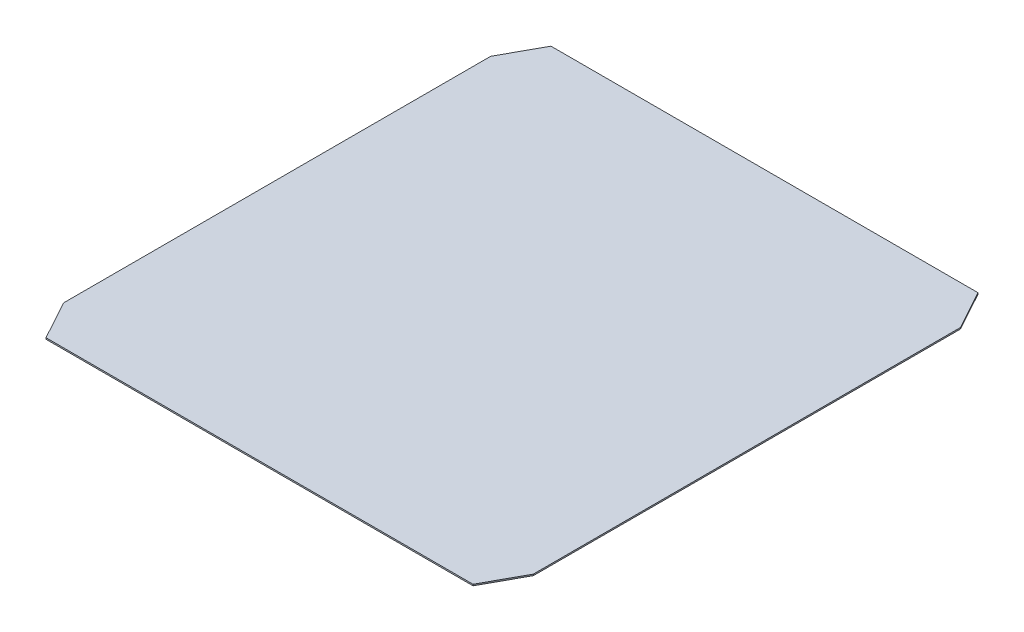
ISO-10303-21;
HEADER;
FILE_DESCRIPTION(('STEP AP214'),'2;1');
FILE_NAME('part.step','',(''),(''),'','','');
FILE_SCHEMA(('AUTOMOTIVE_DESIGN { 1 0 10303 214 1 1 1 1 }'));
ENDSEC;
DATA;
#1=APPLICATION_CONTEXT('core data for automotive mechanical design processes');
#2=APPLICATION_PROTOCOL_DEFINITION('international standard','automotive_design',2000,#1);
#3=PRODUCT_CONTEXT('',#1,'mechanical');
#4=PRODUCT('Part','Part','',(#3));
#5=PRODUCT_RELATED_PRODUCT_CATEGORY('part','',(#4));
#6=PRODUCT_DEFINITION_FORMATION('','',#4);
#7=PRODUCT_DEFINITION_CONTEXT('part definition',#1,'design');
#8=PRODUCT_DEFINITION('design','',#6,#7);
#9=PRODUCT_DEFINITION_SHAPE('','',#8);
#10=(LENGTH_UNIT() NAMED_UNIT(*) SI_UNIT(.MILLI.,.METRE.));
#11=(NAMED_UNIT(*) PLANE_ANGLE_UNIT() SI_UNIT($,.RADIAN.));
#12=(NAMED_UNIT(*) SI_UNIT($,.STERADIAN.) SOLID_ANGLE_UNIT());
#13=UNCERTAINTY_MEASURE_WITH_UNIT(LENGTH_MEASURE(1.E-05),#10,'distance_accuracy_value','');
#14=(GEOMETRIC_REPRESENTATION_CONTEXT(3) GLOBAL_UNCERTAINTY_ASSIGNED_CONTEXT((#13)) GLOBAL_UNIT_ASSIGNED_CONTEXT((#10,
#11,#12)) REPRESENTATION_CONTEXT('',''));
#15=CARTESIAN_POINT('',(0.,0.,0.));
#16=DIRECTION('',(0.,0.,1.));
#17=DIRECTION('',(1.,0.,0.));
#18=AXIS2_PLACEMENT_3D('',#15,#16,#17);
#19=CARTESIAN_POINT('',(-500.500000000008,-3.,-455.));
#20=DIRECTION('',(-1.,0.,0.));
#21=DIRECTION('',(0.,0.,1.));
#22=AXIS2_PLACEMENT_3D('',#19,#20,#21);
#23=PLANE('',#22);
#24=DIRECTION('',(0.,0.,1.));
#25=VECTOR('',#24,1.);
#26=CARTESIAN_POINT('',(-500.500000000008,0.,-455.));
#27=LINE('',#26,#25);
#28=CARTESIAN_POINT('',(-500.500000000008,0.,-455.));
#29=VERTEX_POINT('',#28);
#30=CARTESIAN_POINT('',(-500.500000000008,0.,455.));
#31=VERTEX_POINT('',#30);
#32=EDGE_CURVE('E133',#29,#31,#27,.T.);
#33=ORIENTED_EDGE('',*,*,#32,.F.);
#34=DIRECTION('',(0.,1.,0.));
#35=VECTOR('',#34,1.);
#36=CARTESIAN_POINT('',(-500.500000000008,-3.,-455.));
#37=LINE('',#36,#35);
#38=CARTESIAN_POINT('',(-500.500000000008,-3.,-455.));
#39=VERTEX_POINT('',#38);
#40=EDGE_CURVE('E11',#39,#29,#37,.T.);
#41=ORIENTED_EDGE('',*,*,#40,.F.);
#42=DIRECTION('',(0.,0.,1.));
#43=VECTOR('',#42,1.);
#44=CARTESIAN_POINT('',(-500.500000000008,-3.,-455.));
#45=LINE('',#44,#43);
#46=CARTESIAN_POINT('',(-500.500000000008,-3.,455.));
#47=VERTEX_POINT('',#46);
#48=EDGE_CURVE('E153',#39,#47,#45,.T.);
#49=ORIENTED_EDGE('',*,*,#48,.T.);
#50=DIRECTION('',(0.,1.,0.));
#51=VECTOR('',#50,1.);
#52=CARTESIAN_POINT('',(-500.500000000008,-3.,455.));
#53=LINE('',#52,#51);
#54=EDGE_CURVE('E39',#47,#31,#53,.T.);
#55=ORIENTED_EDGE('',*,*,#54,.T.);
#56=EDGE_LOOP('',(#33,#41,#49,#55));
#57=FACE_BOUND('',#56,.T.);
#58=ADVANCED_FACE('F36',(#57),#23,.T.);
#59=CARTESIAN_POINT('',(-500.500000000008,-3.,-455.));
#60=DIRECTION('',(-0.876884240003085,0.,-0.480701601447521));
#61=DIRECTION('',(-0.480701601447521,0.,0.876884240003085));
#62=AXIS2_PLACEMENT_3D('',#59,#60,#61);
#63=PLANE('',#62);
#64=DIRECTION('',(-0.480701601447521,0.,0.876884240003085));
#65=VECTOR('',#64,1.);
#66=CARTESIAN_POINT('',(-500.500000000008,0.,-455.));
#67=LINE('',#66,#65);
#68=CARTESIAN_POINT('',(-455.,0.,-538.000000000007));
#69=VERTEX_POINT('',#68);
#70=EDGE_CURVE('E151',#69,#29,#67,.T.);
#71=ORIENTED_EDGE('',*,*,#70,.F.);
#72=DIRECTION('',(0.,1.,0.));
#73=VECTOR('',#72,1.);
#74=CARTESIAN_POINT('',(-455.,-3.,-538.000000000007));
#75=LINE('',#74,#73);
#76=CARTESIAN_POINT('',(-455.,-3.,-538.000000000007));
#77=VERTEX_POINT('',#76);
#78=EDGE_CURVE('E45',#77,#69,#75,.T.);
#79=ORIENTED_EDGE('',*,*,#78,.F.);
#80=DIRECTION('',(-0.480701601447521,0.,0.876884240003085));
#81=VECTOR('',#80,1.);
#82=CARTESIAN_POINT('',(-500.500000000008,-3.,-455.));
#83=LINE('',#82,#81);
#84=EDGE_CURVE('E123',#77,#39,#83,.T.);
#85=ORIENTED_EDGE('',*,*,#84,.T.);
#86=ORIENTED_EDGE('',*,*,#40,.T.);
#87=EDGE_LOOP('',(#71,#79,#85,#86));
#88=FACE_BOUND('',#87,.T.);
#89=ADVANCED_FACE('F165',(#88),#63,.T.);
#90=CARTESIAN_POINT('',(454.999999999996,-3.,-538.00000000001));
#91=DIRECTION('',(0.,0.,-1.));
#92=DIRECTION('',(-1.,0.,0.));
#93=AXIS2_PLACEMENT_3D('',#90,#91,#92);
#94=PLANE('',#93);
#95=DIRECTION('',(-1.,0.,0.));
#96=VECTOR('',#95,1.);
#97=CARTESIAN_POINT('',(454.999999999996,0.,-538.00000000001));
#98=LINE('',#97,#96);
#99=CARTESIAN_POINT('',(454.999999999996,0.,-538.00000000001));
#100=VERTEX_POINT('',#99);
#101=EDGE_CURVE('E110',#100,#69,#98,.T.);
#102=ORIENTED_EDGE('',*,*,#101,.F.);
#103=DIRECTION('',(0.,1.,0.));
#104=VECTOR('',#103,1.);
#105=CARTESIAN_POINT('',(454.999999999996,-3.,-538.00000000001));
#106=LINE('',#105,#104);
#107=CARTESIAN_POINT('',(454.999999999996,-3.,-538.00000000001));
#108=VERTEX_POINT('',#107);
#109=EDGE_CURVE('E105',#108,#100,#106,.T.);
#110=ORIENTED_EDGE('',*,*,#109,.F.);
#111=DIRECTION('',(-1.,0.,0.));
#112=VECTOR('',#111,1.);
#113=CARTESIAN_POINT('',(454.999999999996,-3.,-538.00000000001));
#114=LINE('',#113,#112);
#115=EDGE_CURVE('E108',#108,#77,#114,.T.);
#116=ORIENTED_EDGE('',*,*,#115,.T.);
#117=ORIENTED_EDGE('',*,*,#78,.T.);
#118=EDGE_LOOP('',(#102,#110,#116,#117));
#119=FACE_BOUND('',#118,.T.);
#120=ADVANCED_FACE('F107',(#119),#94,.T.);
#121=CARTESIAN_POINT('',(500.500000000005,-3.,-455.000000000004));
#122=DIRECTION('',(0.876884240003082,0.,-0.480701601447528));
#123=DIRECTION('',(-0.480701601447528,0.,-0.876884240003082));
#124=AXIS2_PLACEMENT_3D('',#121,#122,#123);
#125=PLANE('',#124);
#126=DIRECTION('',(-0.480701601447528,0.,-0.876884240003082));
#127=VECTOR('',#126,1.);
#128=CARTESIAN_POINT('',(500.500000000005,0.,-455.000000000004));
#129=LINE('',#128,#127);
#130=CARTESIAN_POINT('',(500.500000000005,0.,-455.000000000004));
#131=VERTEX_POINT('',#130);
#132=EDGE_CURVE('E148',#131,#100,#129,.T.);
#133=ORIENTED_EDGE('',*,*,#132,.F.);
#134=DIRECTION('',(0.,1.,0.));
#135=VECTOR('',#134,1.);
#136=CARTESIAN_POINT('',(500.500000000005,-3.,-455.000000000004));
#137=LINE('',#136,#135);
#138=CARTESIAN_POINT('',(500.500000000005,-3.,-455.000000000004));
#139=VERTEX_POINT('',#138);
#140=EDGE_CURVE('E115',#139,#131,#137,.T.);
#141=ORIENTED_EDGE('',*,*,#140,.F.);
#142=DIRECTION('',(-0.480701601447528,0.,-0.876884240003082));
#143=VECTOR('',#142,1.);
#144=CARTESIAN_POINT('',(500.500000000005,-3.,-455.000000000004));
#145=LINE('',#144,#143);
#146=EDGE_CURVE('E121',#139,#108,#145,.T.);
#147=ORIENTED_EDGE('',*,*,#146,.T.);
#148=ORIENTED_EDGE('',*,*,#109,.T.);
#149=EDGE_LOOP('',(#133,#141,#147,#148));
#150=FACE_BOUND('',#149,.T.);
#151=ADVANCED_FACE('F125',(#150),#125,.T.);
#152=CARTESIAN_POINT('',(500.500000000005,-3.,455.000000000004));
#153=DIRECTION('',(1.,0.,0.));
#154=DIRECTION('',(0.,0.,-1.));
#155=AXIS2_PLACEMENT_3D('',#152,#153,#154);
#156=PLANE('',#155);
#157=DIRECTION('',(0.,0.,-1.));
#158=VECTOR('',#157,1.);
#159=CARTESIAN_POINT('',(500.500000000005,0.,455.000000000004));
#160=LINE('',#159,#158);
#161=CARTESIAN_POINT('',(500.500000000005,0.,455.000000000004));
#162=VERTEX_POINT('',#161);
#163=EDGE_CURVE('E145',#162,#131,#160,.T.);
#164=ORIENTED_EDGE('',*,*,#163,.F.);
#165=DIRECTION('',(0.,1.,0.));
#166=VECTOR('',#165,1.);
#167=CARTESIAN_POINT('',(500.500000000005,-3.,455.000000000004));
#168=LINE('',#167,#166);
#169=CARTESIAN_POINT('',(500.500000000005,-3.,455.000000000004));
#170=VERTEX_POINT('',#169);
#171=EDGE_CURVE('E157',#170,#162,#168,.T.);
#172=ORIENTED_EDGE('',*,*,#171,.F.);
#173=DIRECTION('',(0.,0.,-1.));
#174=VECTOR('',#173,1.);
#175=CARTESIAN_POINT('',(500.500000000005,-3.,455.000000000004));
#176=LINE('',#175,#174);
#177=EDGE_CURVE('E126',#170,#139,#176,.T.);
#178=ORIENTED_EDGE('',*,*,#177,.T.);
#179=ORIENTED_EDGE('',*,*,#140,.T.);
#180=EDGE_LOOP('',(#164,#172,#178,#179));
#181=FACE_BOUND('',#180,.T.);
#182=ADVANCED_FACE('F178',(#181),#156,.T.);
#183=CARTESIAN_POINT('',(500.500000000005,-3.,455.000000000004));
#184=DIRECTION('',(0.876884240003082,0.,0.480701601447528));
#185=DIRECTION('',(0.480701601447528,0.,-0.876884240003082));
#186=AXIS2_PLACEMENT_3D('',#183,#184,#185);
#187=PLANE('',#186);
#188=DIRECTION('',(0.480701601447528,0.,-0.876884240003082));
#189=VECTOR('',#188,1.);
#190=CARTESIAN_POINT('',(500.500000000005,0.,455.000000000004));
#191=LINE('',#190,#189);
#192=CARTESIAN_POINT('',(454.999999999996,0.,538.00000000001));
#193=VERTEX_POINT('',#192);
#194=EDGE_CURVE('E142',#193,#162,#191,.T.);
#195=ORIENTED_EDGE('',*,*,#194,.F.);
#196=DIRECTION('',(0.,1.,0.));
#197=VECTOR('',#196,1.);
#198=CARTESIAN_POINT('',(454.999999999996,-3.,538.00000000001));
#199=LINE('',#198,#197);
#200=CARTESIAN_POINT('',(454.999999999996,-3.,538.00000000001));
#201=VERTEX_POINT('',#200);
#202=EDGE_CURVE('E159',#201,#193,#199,.T.);
#203=ORIENTED_EDGE('',*,*,#202,.F.);
#204=DIRECTION('',(0.480701601447528,0.,-0.876884240003082));
#205=VECTOR('',#204,1.);
#206=CARTESIAN_POINT('',(500.500000000005,-3.,455.000000000004));
#207=LINE('',#206,#205);
#208=EDGE_CURVE('E128',#201,#170,#207,.T.);
#209=ORIENTED_EDGE('',*,*,#208,.T.);
#210=ORIENTED_EDGE('',*,*,#171,.T.);
#211=EDGE_LOOP('',(#195,#203,#209,#210));
#212=FACE_BOUND('',#211,.T.);
#213=ADVANCED_FACE('F181',(#212),#187,.T.);
#214=CARTESIAN_POINT('',(-455.,-3.,538.000000000007));
#215=DIRECTION('',(0.,0.,1.));
#216=DIRECTION('',(1.,0.,0.));
#217=AXIS2_PLACEMENT_3D('',#214,#215,#216);
#218=PLANE('',#217);
#219=DIRECTION('',(1.,0.,0.));
#220=VECTOR('',#219,1.);
#221=CARTESIAN_POINT('',(-455.,0.,538.000000000007));
#222=LINE('',#221,#220);
#223=CARTESIAN_POINT('',(-455.,0.,538.000000000007));
#224=VERTEX_POINT('',#223);
#225=EDGE_CURVE('E139',#224,#193,#222,.T.);
#226=ORIENTED_EDGE('',*,*,#225,.F.);
#227=DIRECTION('',(0.,1.,0.));
#228=VECTOR('',#227,1.);
#229=CARTESIAN_POINT('',(-455.,-3.,538.000000000007));
#230=LINE('',#229,#228);
#231=CARTESIAN_POINT('',(-455.,-3.,538.000000000007));
#232=VERTEX_POINT('',#231);
#233=EDGE_CURVE('E160',#232,#224,#230,.T.);
#234=ORIENTED_EDGE('',*,*,#233,.F.);
#235=DIRECTION('',(1.,0.,0.));
#236=VECTOR('',#235,1.);
#237=CARTESIAN_POINT('',(-455.,-3.,538.000000000007));
#238=LINE('',#237,#236);
#239=EDGE_CURVE('E276',#232,#201,#238,.T.);
#240=ORIENTED_EDGE('',*,*,#239,.T.);
#241=ORIENTED_EDGE('',*,*,#202,.T.);
#242=EDGE_LOOP('',(#226,#234,#240,#241));
#243=FACE_BOUND('',#242,.T.);
#244=ADVANCED_FACE('F185',(#243),#218,.T.);
#245=CARTESIAN_POINT('',(-500.500000000008,-3.,455.));
#246=DIRECTION('',(-0.876884240003085,0.,0.480701601447521));
#247=DIRECTION('',(0.480701601447521,0.,0.876884240003085));
#248=AXIS2_PLACEMENT_3D('',#245,#246,#247);
#249=PLANE('',#248);
#250=DIRECTION('',(0.480701601447521,0.,0.876884240003085));
#251=VECTOR('',#250,1.);
#252=CARTESIAN_POINT('',(-500.500000000008,0.,455.));
#253=LINE('',#252,#251);
#254=EDGE_CURVE('E136',#31,#224,#253,.T.);
#255=ORIENTED_EDGE('',*,*,#254,.F.);
#256=ORIENTED_EDGE('',*,*,#54,.F.);
#257=DIRECTION('',(0.480701601447521,0.,0.876884240003085));
#258=VECTOR('',#257,1.);
#259=CARTESIAN_POINT('',(-500.500000000008,-3.,455.));
#260=LINE('',#259,#258);
#261=EDGE_CURVE('E277',#47,#232,#260,.T.);
#262=ORIENTED_EDGE('',*,*,#261,.T.);
#263=ORIENTED_EDGE('',*,*,#233,.T.);
#264=EDGE_LOOP('',(#255,#256,#262,#263));
#265=FACE_BOUND('',#264,.T.);
#266=ADVANCED_FACE('F162',(#265),#249,.T.);
#267=CARTESIAN_POINT('',(0.,-3.,0.));
#268=DIRECTION('',(0.,1.,0.));
#269=DIRECTION('',(0.,0.,1.));
#270=AXIS2_PLACEMENT_3D('',#267,#268,#269);
#271=PLANE('',#270);
#272=ORIENTED_EDGE('',*,*,#48,.F.);
#273=ORIENTED_EDGE('',*,*,#84,.F.);
#274=ORIENTED_EDGE('',*,*,#115,.F.);
#275=ORIENTED_EDGE('',*,*,#146,.F.);
#276=ORIENTED_EDGE('',*,*,#177,.F.);
#277=ORIENTED_EDGE('',*,*,#208,.F.);
#278=ORIENTED_EDGE('',*,*,#239,.F.);
#279=ORIENTED_EDGE('',*,*,#261,.F.);
#280=EDGE_LOOP('',(#272,#273,#274,#275,#276,#277,#278,#279));
#281=FACE_BOUND('',#280,.T.);
#282=ADVANCED_FACE('F119',(#281),#271,.F.);
#283=CARTESIAN_POINT('',(0.,0.,0.));
#284=DIRECTION('',(0.,1.,0.));
#285=DIRECTION('',(0.,0.,1.));
#286=AXIS2_PLACEMENT_3D('',#283,#284,#285);
#287=PLANE('',#286);
#288=ORIENTED_EDGE('',*,*,#32,.T.);
#289=ORIENTED_EDGE('',*,*,#254,.T.);
#290=ORIENTED_EDGE('',*,*,#225,.T.);
#291=ORIENTED_EDGE('',*,*,#194,.T.);
#292=ORIENTED_EDGE('',*,*,#163,.T.);
#293=ORIENTED_EDGE('',*,*,#132,.T.);
#294=ORIENTED_EDGE('',*,*,#101,.T.);
#295=ORIENTED_EDGE('',*,*,#70,.T.);
#296=EDGE_LOOP('',(#288,#289,#290,#291,#292,#293,#294,#295));
#297=FACE_BOUND('',#296,.T.);
#298=ADVANCED_FACE('F164',(#297),#287,.T.);
#299=CLOSED_SHELL('',(#58,#89,#120,#151,#182,#213,#244,#266,#282,#298));
#300=MANIFOLD_SOLID_BREP('B2',#299);
#301=ADVANCED_BREP_SHAPE_REPRESENTATION('',(#18,#300),#14);
#302=SHAPE_DEFINITION_REPRESENTATION(#9,#301);
ENDSEC;
END-ISO-10303-21;
